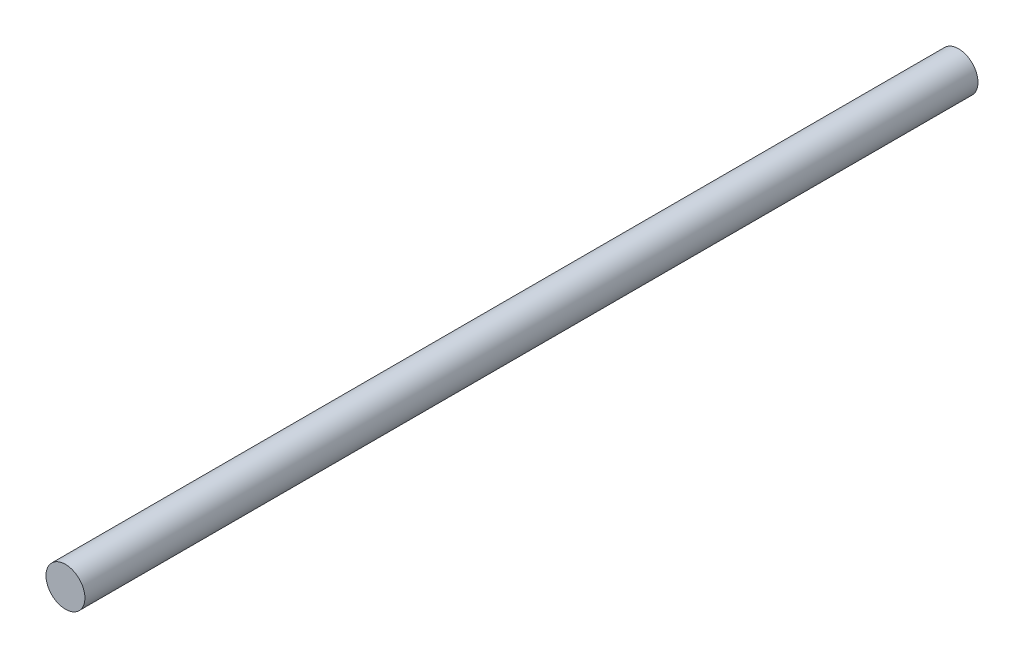
ISO-10303-21;
HEADER;
FILE_DESCRIPTION(('STEP AP214'),'2;1');
FILE_NAME('part.step','',(''),(''),'','','');
FILE_SCHEMA(('AUTOMOTIVE_DESIGN { 1 0 10303 214 1 1 1 1 }'));
ENDSEC;
DATA;
#1=APPLICATION_CONTEXT('core data for automotive mechanical design processes');
#2=APPLICATION_PROTOCOL_DEFINITION('international standard','automotive_design',2000,#1);
#3=PRODUCT_CONTEXT('',#1,'mechanical');
#4=PRODUCT('Part','Part','',(#3));
#5=PRODUCT_RELATED_PRODUCT_CATEGORY('part','',(#4));
#6=PRODUCT_DEFINITION_FORMATION('','',#4);
#7=PRODUCT_DEFINITION_CONTEXT('part definition',#1,'design');
#8=PRODUCT_DEFINITION('design','',#6,#7);
#9=PRODUCT_DEFINITION_SHAPE('','',#8);
#10=(LENGTH_UNIT() NAMED_UNIT(*) SI_UNIT(.MILLI.,.METRE.));
#11=(NAMED_UNIT(*) PLANE_ANGLE_UNIT() SI_UNIT($,.RADIAN.));
#12=(NAMED_UNIT(*) SI_UNIT($,.STERADIAN.) SOLID_ANGLE_UNIT());
#13=UNCERTAINTY_MEASURE_WITH_UNIT(LENGTH_MEASURE(1.E-05),#10,'distance_accuracy_value','');
#14=(GEOMETRIC_REPRESENTATION_CONTEXT(3) GLOBAL_UNCERTAINTY_ASSIGNED_CONTEXT((#13)) GLOBAL_UNIT_ASSIGNED_CONTEXT((#10,
#11,#12)) REPRESENTATION_CONTEXT('',''));
#15=CARTESIAN_POINT('',(0.,0.,0.));
#16=DIRECTION('',(0.,0.,1.));
#17=DIRECTION('',(1.,0.,0.));
#18=AXIS2_PLACEMENT_3D('',#15,#16,#17);
#19=CARTESIAN_POINT('',(0.,0.,-500.));
#20=DIRECTION('',(0.,0.,1.));
#21=DIRECTION('',(1.,0.,0.));
#22=AXIS2_PLACEMENT_3D('',#19,#20,#21);
#23=CYLINDRICAL_SURFACE('',#22,10.9);
#24=CARTESIAN_POINT('',(0.,0.,-500.));
#25=DIRECTION('',(0.,0.,1.));
#26=DIRECTION('',(1.,0.,0.));
#27=AXIS2_PLACEMENT_3D('',#24,#25,#26);
#28=CIRCLE('',#27,10.9);
#29=CARTESIAN_POINT('',(10.9,0.,-500.));
#30=VERTEX_POINT('',#29);
#31=EDGE_CURVE('E10',#30,#30,#28,.T.);
#32=ORIENTED_EDGE('',*,*,#31,.T.);
#33=EDGE_LOOP('',(#32));
#34=FACE_BOUND('',#33,.T.);
#35=CARTESIAN_POINT('',(0.,0.,0.));
#36=DIRECTION('',(0.,0.,1.));
#37=DIRECTION('',(1.,0.,0.));
#38=AXIS2_PLACEMENT_3D('',#35,#36,#37);
#39=CIRCLE('',#38,10.9);
#40=CARTESIAN_POINT('',(10.9,0.,0.));
#41=VERTEX_POINT('',#40);
#42=EDGE_CURVE('E40',#41,#41,#39,.T.);
#43=ORIENTED_EDGE('',*,*,#42,.F.);
#44=EDGE_LOOP('',(#43));
#45=FACE_BOUND('',#44,.T.);
#46=ADVANCED_FACE('F37',(#34,#45),#23,.T.);
#47=CARTESIAN_POINT('',(0.,0.,-500.));
#48=DIRECTION('',(0.,0.,1.));
#49=DIRECTION('',(1.,0.,0.));
#50=AXIS2_PLACEMENT_3D('',#47,#48,#49);
#51=PLANE('',#50);
#52=ORIENTED_EDGE('',*,*,#31,.F.);
#53=EDGE_LOOP('',(#52));
#54=FACE_BOUND('',#53,.T.);
#55=ADVANCED_FACE('F54',(#54),#51,.F.);
#56=CARTESIAN_POINT('',(0.,0.,0.));
#57=DIRECTION('',(0.,0.,1.));
#58=DIRECTION('',(1.,0.,0.));
#59=AXIS2_PLACEMENT_3D('',#56,#57,#58);
#60=PLANE('',#59);
#61=ORIENTED_EDGE('',*,*,#42,.T.);
#62=EDGE_LOOP('',(#61));
#63=FACE_BOUND('',#62,.T.);
#64=ADVANCED_FACE('F51',(#63),#60,.T.);
#65=CLOSED_SHELL('',(#46,#55,#64));
#66=MANIFOLD_SOLID_BREP('B2',#65);
#67=ADVANCED_BREP_SHAPE_REPRESENTATION('',(#18,#66),#14);
#68=SHAPE_DEFINITION_REPRESENTATION(#9,#67);
ENDSEC;
END-ISO-10303-21;
